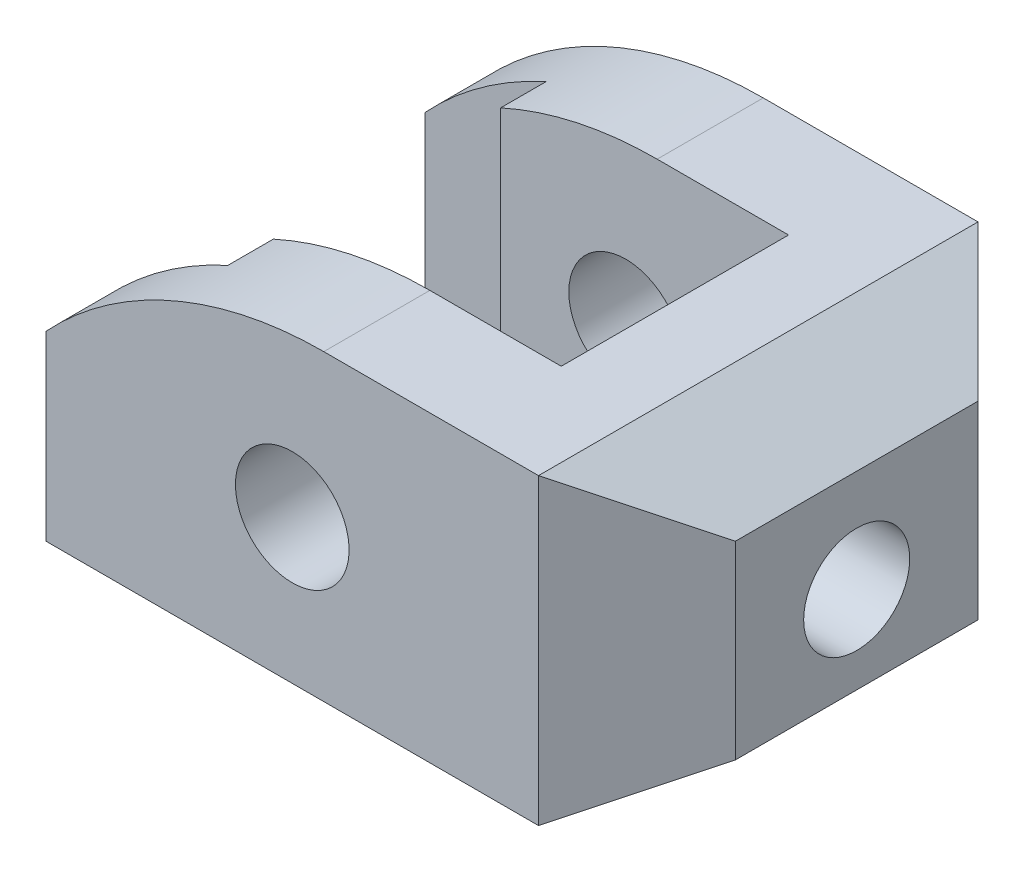
ISO-10303-21;
HEADER;
FILE_DESCRIPTION(('STEP AP214'),'2;1');
FILE_NAME('part.step','',(''),(''),'','','');
FILE_SCHEMA(('AUTOMOTIVE_DESIGN { 1 0 10303 214 1 1 1 1 }'));
ENDSEC;
DATA;
#1=APPLICATION_CONTEXT('core data for automotive mechanical design processes');
#2=APPLICATION_PROTOCOL_DEFINITION('international standard','automotive_design',2000,#1);
#3=PRODUCT_CONTEXT('',#1,'mechanical');
#4=PRODUCT('Part','Part','',(#3));
#5=PRODUCT_RELATED_PRODUCT_CATEGORY('part','',(#4));
#6=PRODUCT_DEFINITION_FORMATION('','',#4);
#7=PRODUCT_DEFINITION_CONTEXT('part definition',#1,'design');
#8=PRODUCT_DEFINITION('design','',#6,#7);
#9=PRODUCT_DEFINITION_SHAPE('','',#8);
#10=(LENGTH_UNIT() NAMED_UNIT(*) SI_UNIT(.MILLI.,.METRE.));
#11=(NAMED_UNIT(*) PLANE_ANGLE_UNIT() SI_UNIT($,.RADIAN.));
#12=(NAMED_UNIT(*) SI_UNIT($,.STERADIAN.) SOLID_ANGLE_UNIT());
#13=UNCERTAINTY_MEASURE_WITH_UNIT(LENGTH_MEASURE(1.E-05),#10,'distance_accuracy_value','');
#14=(GEOMETRIC_REPRESENTATION_CONTEXT(3) GLOBAL_UNCERTAINTY_ASSIGNED_CONTEXT((#13)) GLOBAL_UNIT_ASSIGNED_CONTEXT((#10,
#11,#12)) REPRESENTATION_CONTEXT('',''));
#15=CARTESIAN_POINT('',(0.,0.,0.));
#16=DIRECTION('',(0.,0.,1.));
#17=DIRECTION('',(1.,0.,0.));
#18=AXIS2_PLACEMENT_3D('',#15,#16,#17);
#19=CARTESIAN_POINT('',(4.16060555964673,-29.,58.));
#20=DIRECTION('',(0.,0.,-1.));
#21=DIRECTION('',(-1.,0.,0.));
#22=AXIS2_PLACEMENT_3D('',#19,#20,#21);
#23=CYLINDRICAL_SURFACE('',#22,50.);
#24=DIRECTION('',(0.,0.,-1.));
#25=VECTOR('',#24,1.);
#26=CARTESIAN_POINT('',(-16.5,16.5317403347236,58.));
#27=LINE('',#26,#25);
#28=CARTESIAN_POINT('',(-16.5,16.5317403347236,44.));
#29=VERTEX_POINT('',#28);
#30=CARTESIAN_POINT('',(-16.5,16.5317403347236,50.));
#31=VERTEX_POINT('',#30);
#32=EDGE_CURVE('E307',#29,#31,#27,.F.);
#33=ORIENTED_EDGE('',*,*,#32,.T.);
#34=CARTESIAN_POINT('',(4.16060555964673,-29.,50.));
#35=DIRECTION('',(0.,0.,1.));
#36=DIRECTION('',(1.,0.,0.));
#37=AXIS2_PLACEMENT_3D('',#34,#35,#36);
#38=CIRCLE('',#37,50.);
#39=CARTESIAN_POINT('',(-32.5,4.99999999999999,50.));
#40=VERTEX_POINT('',#39);
#41=EDGE_CURVE('E236',#31,#40,#38,.T.);
#42=ORIENTED_EDGE('',*,*,#41,.T.);
#43=DIRECTION('',(0.,0.,-1.));
#44=VECTOR('',#43,1.);
#45=CARTESIAN_POINT('',(-32.5,5.,58.));
#46=LINE('',#45,#44);
#47=CARTESIAN_POINT('',(-32.5,5.,58.));
#48=VERTEX_POINT('',#47);
#49=EDGE_CURVE('E265',#48,#40,#46,.T.);
#50=ORIENTED_EDGE('',*,*,#49,.F.);
#51=CARTESIAN_POINT('',(4.16060555964673,-29.,58.));
#52=DIRECTION('',(0.,0.,1.));
#53=DIRECTION('',(-1.,0.,0.));
#54=AXIS2_PLACEMENT_3D('',#51,#52,#53);
#55=CIRCLE('',#54,50.);
#56=CARTESIAN_POINT('',(4.16060555964673,21.,58.));
#57=VERTEX_POINT('',#56);
#58=EDGE_CURVE('E261',#57,#48,#55,.T.);
#59=ORIENTED_EDGE('',*,*,#58,.F.);
#60=DIRECTION('',(0.,0.,-1.));
#61=VECTOR('',#60,1.);
#62=CARTESIAN_POINT('',(4.16060555964673,21.,58.));
#63=LINE('',#62,#61);
#64=CARTESIAN_POINT('',(4.16060555964673,21.,44.));
#65=VERTEX_POINT('',#64);
#66=EDGE_CURVE('E231',#57,#65,#63,.T.);
#67=ORIENTED_EDGE('',*,*,#66,.T.);
#68=CARTESIAN_POINT('',(4.16060555964673,-29.,44.));
#69=DIRECTION('',(0.,0.,1.));
#70=DIRECTION('',(1.,0.,0.));
#71=AXIS2_PLACEMENT_3D('',#68,#69,#70);
#72=CIRCLE('',#71,50.);
#73=EDGE_CURVE('E235',#65,#29,#72,.T.);
#74=ORIENTED_EDGE('',*,*,#73,.T.);
#75=EDGE_LOOP('',(#33,#42,#50,#59,#67,#74));
#76=FACE_BOUND('',#75,.T.);
#77=ADVANCED_FACE('F45',(#76),#23,.T.);
#78=CARTESIAN_POINT('',(-32.5,-19.,58.));
#79=DIRECTION('',(1.,0.,0.));
#80=DIRECTION('',(0.,0.,-1.));
#81=AXIS2_PLACEMENT_3D('',#78,#79,#80);
#82=PLANE('',#81);
#83=ORIENTED_EDGE('',*,*,#49,.T.);
#84=DIRECTION('',(0.,1.,0.));
#85=VECTOR('',#84,1.);
#86=CARTESIAN_POINT('',(-32.5,-19.,50.));
#87=LINE('',#86,#85);
#88=CARTESIAN_POINT('',(-32.5,-19.,50.));
#89=VERTEX_POINT('',#88);
#90=EDGE_CURVE('E325',#89,#40,#87,.T.);
#91=ORIENTED_EDGE('',*,*,#90,.F.);
#92=DIRECTION('',(0.,0.,-1.));
#93=VECTOR('',#92,1.);
#94=CARTESIAN_POINT('',(-32.5,-19.,58.));
#95=LINE('',#94,#93);
#96=CARTESIAN_POINT('',(-32.5,-19.,58.));
#97=VERTEX_POINT('',#96);
#98=EDGE_CURVE('E202',#97,#89,#95,.T.);
#99=ORIENTED_EDGE('',*,*,#98,.F.);
#100=DIRECTION('',(0.,-1.,0.));
#101=VECTOR('',#100,1.);
#102=CARTESIAN_POINT('',(-32.5,-19.,58.));
#103=LINE('',#102,#101);
#104=EDGE_CURVE('E258',#48,#97,#103,.T.);
#105=ORIENTED_EDGE('',*,*,#104,.F.);
#106=EDGE_LOOP('',(#83,#91,#99,#105));
#107=FACE_BOUND('',#106,.T.);
#108=ADVANCED_FACE('F388',(#107),#82,.F.);
#109=CARTESIAN_POINT('',(0.,0.,58.));
#110=DIRECTION('',(0.,0.,-1.));
#111=DIRECTION('',(-1.,0.,0.));
#112=AXIS2_PLACEMENT_3D('',#109,#110,#111);
#113=CYLINDRICAL_SURFACE('',#112,7.5);
#114=CARTESIAN_POINT('',(0.,0.,14.));
#115=DIRECTION('',(0.,0.,-1.));
#116=DIRECTION('',(-1.,0.,0.));
#117=AXIS2_PLACEMENT_3D('',#114,#115,#116);
#118=CIRCLE('',#117,7.5);
#119=CARTESIAN_POINT('',(-7.5,0.,14.));
#120=VERTEX_POINT('',#119);
#121=EDGE_CURVE('E290',#120,#120,#118,.T.);
#122=CARTESIAN_POINT('',(0.,0.,0.));
#123=DIRECTION('',(0.,0.,1.));
#124=DIRECTION('',(1.,0.,0.));
#125=AXIS2_PLACEMENT_3D('',#122,#123,#124);
#126=CIRCLE('',#125,7.5);
#127=CARTESIAN_POINT('',(-7.5,0.,0.));
#128=VERTEX_POINT('',#127);
#129=EDGE_CURVE('E254',#128,#128,#126,.T.);
#130=CARTESIAN_POINT('',(-7.5,0.,14.));
#131=CARTESIAN_POINT('',(-7.5,0.,13.8541666666667));
#132=CARTESIAN_POINT('',(-7.5,0.,13.7083333333333));
#133=CARTESIAN_POINT('',(-7.5,0.,13.4166666666667));
#134=CARTESIAN_POINT('',(-7.5,0.,13.2708333333333));
#135=CARTESIAN_POINT('',(-7.5,0.,12.9791666666667));
#136=CARTESIAN_POINT('',(-7.5,0.,12.8333333333333));
#137=CARTESIAN_POINT('',(-7.5,0.,12.5416666666667));
#138=CARTESIAN_POINT('',(-7.5,0.,12.3958333333333));
#139=CARTESIAN_POINT('',(-7.5,0.,12.1041666666667));
#140=CARTESIAN_POINT('',(-7.5,0.,11.9583333333333));
#141=CARTESIAN_POINT('',(-7.5,0.,11.6666666666667));
#142=CARTESIAN_POINT('',(-7.5,0.,11.5208333333333));
#143=CARTESIAN_POINT('',(-7.5,0.,11.2291666666667));
#144=CARTESIAN_POINT('',(-7.5,0.,11.0833333333333));
#145=CARTESIAN_POINT('',(-7.5,0.,10.7916666666667));
#146=CARTESIAN_POINT('',(-7.5,0.,10.6458333333333));
#147=CARTESIAN_POINT('',(-7.5,0.,10.3541666666667));
#148=CARTESIAN_POINT('',(-7.5,0.,10.2083333333333));
#149=CARTESIAN_POINT('',(-7.5,0.,9.91666666666668));
#150=CARTESIAN_POINT('',(-7.5,0.,9.77083333333334));
#151=CARTESIAN_POINT('',(-7.5,0.,9.47916666666667));
#152=CARTESIAN_POINT('',(-7.5,0.,9.33333333333334));
#153=CARTESIAN_POINT('',(-7.5,0.,9.04166666666667));
#154=CARTESIAN_POINT('',(-7.5,0.,8.89583333333334));
#155=CARTESIAN_POINT('',(-7.5,0.,8.60416666666667));
#156=CARTESIAN_POINT('',(-7.5,0.,8.45833333333334));
#157=CARTESIAN_POINT('',(-7.5,0.,8.16666666666667));
#158=CARTESIAN_POINT('',(-7.5,0.,8.02083333333334));
#159=CARTESIAN_POINT('',(-7.5,0.,7.72916666666667));
#160=CARTESIAN_POINT('',(-7.5,0.,7.58333333333334));
#161=CARTESIAN_POINT('',(-7.5,0.,7.29166666666667));
#162=CARTESIAN_POINT('',(-7.5,0.,7.14583333333334));
#163=CARTESIAN_POINT('',(-7.5,0.,6.85416666666667));
#164=CARTESIAN_POINT('',(-7.5,0.,6.70833333333334));
#165=CARTESIAN_POINT('',(-7.5,0.,6.41666666666667));
#166=CARTESIAN_POINT('',(-7.5,0.,6.27083333333334));
#167=CARTESIAN_POINT('',(-7.5,0.,5.97916666666667));
#168=CARTESIAN_POINT('',(-7.5,0.,5.83333333333334));
#169=CARTESIAN_POINT('',(-7.5,0.,5.54166666666667));
#170=CARTESIAN_POINT('',(-7.5,0.,5.39583333333334));
#171=CARTESIAN_POINT('',(-7.5,0.,5.10416666666667));
#172=CARTESIAN_POINT('',(-7.5,0.,4.95833333333334));
#173=CARTESIAN_POINT('',(-7.5,0.,4.66666666666667));
#174=CARTESIAN_POINT('',(-7.5,0.,4.52083333333334));
#175=CARTESIAN_POINT('',(-7.5,0.,4.22916666666667));
#176=CARTESIAN_POINT('',(-7.5,0.,4.08333333333334));
#177=CARTESIAN_POINT('',(-7.5,0.,3.79166666666667));
#178=CARTESIAN_POINT('',(-7.5,0.,3.64583333333334));
#179=CARTESIAN_POINT('',(-7.5,0.,3.35416666666667));
#180=CARTESIAN_POINT('',(-7.5,0.,3.20833333333334));
#181=CARTESIAN_POINT('',(-7.5,0.,2.91666666666667));
#182=CARTESIAN_POINT('',(-7.5,0.,2.77083333333334));
#183=CARTESIAN_POINT('',(-7.5,0.,2.47916666666667));
#184=CARTESIAN_POINT('',(-7.5,0.,2.33333333333334));
#185=CARTESIAN_POINT('',(-7.5,0.,2.04166666666667));
#186=CARTESIAN_POINT('',(-7.5,0.,1.89583333333333));
#187=CARTESIAN_POINT('',(-7.5,0.,1.60416666666667));
#188=CARTESIAN_POINT('',(-7.5,0.,1.45833333333333));
#189=CARTESIAN_POINT('',(-7.5,0.,1.16666666666667));
#190=CARTESIAN_POINT('',(-7.5,0.,1.02083333333333));
#191=CARTESIAN_POINT('',(-7.5,0.,0.729166666666667));
#192=CARTESIAN_POINT('',(-7.5,0.,0.583333333333334));
#193=CARTESIAN_POINT('',(-7.5,0.,0.291666666666667));
#194=CARTESIAN_POINT('',(-7.5,0.,0.145833333333333));
#195=CARTESIAN_POINT('',(-7.5,0.,0.));
#196=B_SPLINE_CURVE_WITH_KNOTS('',3,(#130,#131,#132,#133,#134,#135,#136,#137,#138,#139,#140,
#141,#142,#143,#144,#145,#146,#147,#148,#149,#150,#151,#152,#153,#154,#155,#156,#157,#158,#159,
#160,#161,#162,#163,#164,#165,#166,#167,#168,#169,#170,#171,#172,#173,#174,#175,#176,#177,#178,
#179,#180,#181,#182,#183,#184,#185,#186,#187,#188,#189,#190,#191,#192,#193,#194,#195),
.UNSPECIFIED.,.F.,.F.,(4,2,2,2,2,2,2,2,2,2,2,2,2,2,2,2,2,2,2,2,2,2,2,2,2,2,2,2,2,2,2,2,4),(0.,
0.4375,0.875000000000001,1.3125,1.75,2.1875,2.625,3.0625,3.5,3.9375,4.375,4.8125,5.25,
5.68750000000001,6.12500000000001,6.56250000000001,7.00000000000001,7.43750000000001,
7.87500000000001,8.31250000000001,8.75000000000001,9.18750000000001,9.62500000000001,10.0625,
10.5,10.9375,11.375,11.8125,12.25,12.6875,13.125,13.5625,14.),.UNSPECIFIED.);
#197=EDGE_CURVE('BSEAM384',#120,#128,#196,.T.);
#198=ORIENTED_EDGE('',*,*,#121,.F.);
#199=ORIENTED_EDGE('',*,*,#129,.F.);
#200=ORIENTED_EDGE('',*,*,#197,.T.);
#201=ORIENTED_EDGE('',*,*,#197,.F.);
#202=EDGE_LOOP('',(#198,#200,#199,#201));
#203=FACE_BOUND('',#202,.T.);
#204=ADVANCED_FACE('F384',(#203),#113,.F.);
#205=CARTESIAN_POINT('',(4.16060555964673,-29.,58.));
#206=DIRECTION('',(0.,0.,-1.));
#207=DIRECTION('',(-1.,0.,0.));
#208=AXIS2_PLACEMENT_3D('',#205,#206,#207);
#209=PLANE('',#208);
#210=DIRECTION('',(1.,0.,0.));
#211=VECTOR('',#210,1.);
#212=CARTESIAN_POINT('',(32.5,-19.,58.));
#213=LINE('',#212,#211);
#214=CARTESIAN_POINT('',(32.5,-19.,58.));
#215=VERTEX_POINT('',#214);
#216=EDGE_CURVE('E255',#97,#215,#213,.T.);
#217=ORIENTED_EDGE('',*,*,#216,.T.);
#218=DIRECTION('',(0.,1.,0.));
#219=VECTOR('',#218,1.);
#220=CARTESIAN_POINT('',(32.5,-19.,58.));
#221=LINE('',#220,#219);
#222=CARTESIAN_POINT('',(32.5,21.,58.));
#223=VERTEX_POINT('',#222);
#224=EDGE_CURVE('E189',#215,#223,#221,.T.);
#225=ORIENTED_EDGE('',*,*,#224,.T.);
#226=DIRECTION('',(-1.,0.,0.));
#227=VECTOR('',#226,1.);
#228=CARTESIAN_POINT('',(32.5,21.,58.));
#229=LINE('',#228,#227);
#230=EDGE_CURVE('E251',#223,#57,#229,.T.);
#231=ORIENTED_EDGE('',*,*,#230,.T.);
#232=ORIENTED_EDGE('',*,*,#58,.T.);
#233=ORIENTED_EDGE('',*,*,#104,.T.);
#234=EDGE_LOOP('',(#217,#225,#231,#232,#233));
#235=FACE_BOUND('',#234,.T.);
#236=CARTESIAN_POINT('',(0.,0.,58.));
#237=DIRECTION('',(0.,0.,1.));
#238=DIRECTION('',(1.,0.,0.));
#239=AXIS2_PLACEMENT_3D('',#236,#237,#238);
#240=CIRCLE('',#239,7.5);
#241=CARTESIAN_POINT('',(-7.5,0.,58.));
#242=VERTEX_POINT('',#241);
#243=EDGE_CURVE('E239',#242,#242,#240,.T.);
#244=ORIENTED_EDGE('',*,*,#243,.F.);
#245=EDGE_LOOP('',(#244));
#246=FACE_BOUND('',#245,.T.);
#247=ADVANCED_FACE('F387',(#235,#246),#209,.F.);
#248=CARTESIAN_POINT('',(4.16060555964673,-29.,0.));
#249=DIRECTION('',(0.,0.,-1.));
#250=DIRECTION('',(-1.,0.,0.));
#251=AXIS2_PLACEMENT_3D('',#248,#249,#250);
#252=PLANE('',#251);
#253=DIRECTION('',(0.,1.,0.));
#254=VECTOR('',#253,1.);
#255=CARTESIAN_POINT('',(32.5,-19.,0.));
#256=LINE('',#255,#254);
#257=CARTESIAN_POINT('',(32.5,-19.,0.));
#258=VERTEX_POINT('',#257);
#259=CARTESIAN_POINT('',(32.5,21.,0.));
#260=VERTEX_POINT('',#259);
#261=EDGE_CURVE('E166',#258,#260,#256,.T.);
#262=ORIENTED_EDGE('',*,*,#261,.F.);
#263=DIRECTION('',(1.,0.,0.));
#264=VECTOR('',#263,1.);
#265=CARTESIAN_POINT('',(32.5,-19.,0.));
#266=LINE('',#265,#264);
#267=CARTESIAN_POINT('',(-32.5,-19.,0.));
#268=VERTEX_POINT('',#267);
#269=EDGE_CURVE('E184',#268,#258,#266,.T.);
#270=ORIENTED_EDGE('',*,*,#269,.F.);
#271=DIRECTION('',(0.,-1.,0.));
#272=VECTOR('',#271,1.);
#273=CARTESIAN_POINT('',(-32.5,-19.,0.));
#274=LINE('',#273,#272);
#275=CARTESIAN_POINT('',(-32.5,5.,0.));
#276=VERTEX_POINT('',#275);
#277=EDGE_CURVE('E241',#276,#268,#274,.T.);
#278=ORIENTED_EDGE('',*,*,#277,.F.);
#279=CARTESIAN_POINT('',(4.16060555964673,-29.,0.));
#280=DIRECTION('',(0.,0.,1.));
#281=DIRECTION('',(-1.,0.,0.));
#282=AXIS2_PLACEMENT_3D('',#279,#280,#281);
#283=CIRCLE('',#282,50.);
#284=CARTESIAN_POINT('',(4.16060555964673,21.,0.));
#285=VERTEX_POINT('',#284);
#286=EDGE_CURVE('E246',#285,#276,#283,.T.);
#287=ORIENTED_EDGE('',*,*,#286,.F.);
#288=DIRECTION('',(-1.,0.,0.));
#289=VECTOR('',#288,1.);
#290=CARTESIAN_POINT('',(32.5,21.,0.));
#291=LINE('',#290,#289);
#292=EDGE_CURVE('E187',#260,#285,#291,.T.);
#293=ORIENTED_EDGE('',*,*,#292,.F.);
#294=EDGE_LOOP('',(#262,#270,#278,#287,#293));
#295=FACE_BOUND('',#294,.T.);
#296=ORIENTED_EDGE('',*,*,#129,.T.);
#297=EDGE_LOOP('',(#296));
#298=FACE_BOUND('',#297,.T.);
#299=ADVANCED_FACE('F181',(#295,#298),#252,.T.);
#300=CARTESIAN_POINT('',(4.16060555964673,-29.,8.));
#301=DIRECTION('',(0.,0.,-1.));
#302=DIRECTION('',(-1.,0.,0.));
#303=AXIS2_PLACEMENT_3D('',#300,#301,#302);
#304=CIRCLE('',#303,50.);
#305=CARTESIAN_POINT('',(-32.5,4.99999999999999,8.));
#306=VERTEX_POINT('',#305);
#307=CARTESIAN_POINT('',(-16.5,16.5317403347236,8.));
#308=VERTEX_POINT('',#307);
#309=EDGE_CURVE('E99',#306,#308,#304,.T.);
#310=ORIENTED_EDGE('',*,*,#309,.T.);
#311=DIRECTION('',(0.,0.,-1.));
#312=VECTOR('',#311,1.);
#313=CARTESIAN_POINT('',(-16.5,16.5317403347236,58.));
#314=LINE('',#313,#312);
#315=CARTESIAN_POINT('',(-16.5,16.5317403347236,14.));
#316=VERTEX_POINT('',#315);
#317=EDGE_CURVE('E70',#308,#316,#314,.F.);
#318=ORIENTED_EDGE('',*,*,#317,.T.);
#319=CARTESIAN_POINT('',(4.16060555964673,-29.,14.));
#320=DIRECTION('',(0.,0.,-1.));
#321=DIRECTION('',(-1.,0.,0.));
#322=AXIS2_PLACEMENT_3D('',#319,#320,#321);
#323=CIRCLE('',#322,50.);
#324=CARTESIAN_POINT('',(4.16060555964673,21.,14.));
#325=VERTEX_POINT('',#324);
#326=EDGE_CURVE('E273',#316,#325,#323,.T.);
#327=ORIENTED_EDGE('',*,*,#326,.T.);
#328=EDGE_CURVE('E237',#325,#285,#63,.T.);
#329=ORIENTED_EDGE('',*,*,#328,.T.);
#330=ORIENTED_EDGE('',*,*,#286,.T.);
#331=EDGE_CURVE('E245',#306,#276,#46,.T.);
#332=ORIENTED_EDGE('',*,*,#331,.F.);
#333=EDGE_LOOP('',(#310,#318,#327,#329,#330,#332));
#334=FACE_BOUND('',#333,.T.);
#335=ADVANCED_FACE('F47',(#334),#23,.T.);
#336=CARTESIAN_POINT('',(-32.5,-19.,8.));
#337=VERTEX_POINT('',#336);
#338=EDGE_CURVE('E199',#337,#268,#95,.T.);
#339=ORIENTED_EDGE('',*,*,#338,.F.);
#340=DIRECTION('',(0.,1.,0.));
#341=VECTOR('',#340,1.);
#342=CARTESIAN_POINT('',(-32.5,-19.,8.));
#343=LINE('',#342,#341);
#344=EDGE_CURVE('E250',#337,#306,#343,.T.);
#345=ORIENTED_EDGE('',*,*,#344,.T.);
#346=ORIENTED_EDGE('',*,*,#331,.T.);
#347=ORIENTED_EDGE('',*,*,#277,.T.);
#348=EDGE_LOOP('',(#339,#345,#346,#347));
#349=FACE_BOUND('',#348,.T.);
#350=ADVANCED_FACE('F399',(#349),#82,.F.);
#351=CARTESIAN_POINT('',(32.5,-19.,58.));
#352=DIRECTION('',(0.,1.,0.));
#353=DIRECTION('',(-1.,0.,0.));
#354=AXIS2_PLACEMENT_3D('',#351,#352,#353);
#355=PLANE('',#354);
#356=DIRECTION('',(-1.,0.,0.));
#357=VECTOR('',#356,1.);
#358=CARTESIAN_POINT('',(21.5,-19.,14.));
#359=LINE('',#358,#357);
#360=CARTESIAN_POINT('',(21.5,-19.,14.));
#361=VERTEX_POINT('',#360);
#362=CARTESIAN_POINT('',(-16.5,-19.,14.));
#363=VERTEX_POINT('',#362);
#364=EDGE_CURVE('E244',#361,#363,#359,.T.);
#365=ORIENTED_EDGE('',*,*,#364,.T.);
#366=DIRECTION('',(0.,0.,-1.));
#367=VECTOR('',#366,1.);
#368=CARTESIAN_POINT('',(-16.5,-19.,14.));
#369=LINE('',#368,#367);
#370=CARTESIAN_POINT('',(-16.5,-19.,8.));
#371=VERTEX_POINT('',#370);
#372=EDGE_CURVE('E296',#363,#371,#369,.T.);
#373=ORIENTED_EDGE('',*,*,#372,.T.);
#374=DIRECTION('',(-1.,0.,0.));
#375=VECTOR('',#374,1.);
#376=CARTESIAN_POINT('',(-16.5,-19.,8.));
#377=LINE('',#376,#375);
#378=EDGE_CURVE('E335',#371,#337,#377,.T.);
#379=ORIENTED_EDGE('',*,*,#378,.T.);
#380=ORIENTED_EDGE('',*,*,#338,.T.);
#381=ORIENTED_EDGE('',*,*,#269,.T.);
#382=DIRECTION('',(0.,0.,-1.));
#383=VECTOR('',#382,1.);
#384=CARTESIAN_POINT('',(32.5,-19.,58.));
#385=LINE('',#384,#383);
#386=EDGE_CURVE('E196',#215,#258,#385,.T.);
#387=ORIENTED_EDGE('',*,*,#386,.F.);
#388=ORIENTED_EDGE('',*,*,#216,.F.);
#389=ORIENTED_EDGE('',*,*,#98,.T.);
#390=DIRECTION('',(1.,0.,0.));
#391=VECTOR('',#390,1.);
#392=CARTESIAN_POINT('',(-16.5,-19.,50.));
#393=LINE('',#392,#391);
#394=CARTESIAN_POINT('',(-16.5,-19.,50.));
#395=VERTEX_POINT('',#394);
#396=EDGE_CURVE('E317',#89,#395,#393,.T.);
#397=ORIENTED_EDGE('',*,*,#396,.T.);
#398=DIRECTION('',(0.,0.,-1.));
#399=VECTOR('',#398,1.);
#400=CARTESIAN_POINT('',(-16.5,-19.,44.));
#401=LINE('',#400,#399);
#402=CARTESIAN_POINT('',(-16.5,-19.,44.));
#403=VERTEX_POINT('',#402);
#404=EDGE_CURVE('E301',#395,#403,#401,.T.);
#405=ORIENTED_EDGE('',*,*,#404,.T.);
#406=DIRECTION('',(1.,0.,0.));
#407=VECTOR('',#406,1.);
#408=CARTESIAN_POINT('',(21.5,-19.,44.));
#409=LINE('',#408,#407);
#410=CARTESIAN_POINT('',(21.5,-19.,44.));
#411=VERTEX_POINT('',#410);
#412=EDGE_CURVE('E216',#403,#411,#409,.T.);
#413=ORIENTED_EDGE('',*,*,#412,.T.);
#414=DIRECTION('',(0.,0.,-1.));
#415=VECTOR('',#414,1.);
#416=CARTESIAN_POINT('',(21.5,-19.,44.));
#417=LINE('',#416,#415);
#418=EDGE_CURVE('E209',#411,#361,#417,.T.);
#419=ORIENTED_EDGE('',*,*,#418,.T.);
#420=EDGE_LOOP('',(#365,#373,#379,#380,#381,#387,#388,#389,#397,#405,#413,#419));
#421=FACE_BOUND('',#420,.T.);
#422=ADVANCED_FACE('F194',(#421),#355,.F.);
#423=CARTESIAN_POINT('',(32.5,-19.,58.));
#424=DIRECTION('',(-0.500000000000001,0.866025403784438,0.));
#425=DIRECTION('',(-0.866025403784438,-0.500000000000001,0.));
#426=AXIS2_PLACEMENT_3D('',#423,#424,#425);
#427=PLANE('',#426);
#428=ORIENTED_EDGE('',*,*,#386,.T.);
#429=DIRECTION('',(0.654653670707976,0.377964473009228,0.654653670707978));
#430=VECTOR('',#429,1.);
#431=CARTESIAN_POINT('',(57.3571428571428,-4.64872188014355,24.857142857143));
#432=LINE('',#431,#430);
#433=CARTESIAN_POINT('',(45.4903810567666,-11.5,12.9903810567667));
#434=VERTEX_POINT('',#433);
#435=EDGE_CURVE('E163',#258,#434,#432,.T.);
#436=ORIENTED_EDGE('',*,*,#435,.T.);
#437=DIRECTION('',(0.,0.,-1.));
#438=VECTOR('',#437,1.);
#439=CARTESIAN_POINT('',(45.4903810567666,-11.5,58.));
#440=LINE('',#439,#438);
#441=CARTESIAN_POINT('',(45.4903810567666,-11.5,45.0096189432334));
#442=VERTEX_POINT('',#441);
#443=EDGE_CURVE('E208',#442,#434,#440,.T.);
#444=ORIENTED_EDGE('',*,*,#443,.F.);
#445=DIRECTION('',(-0.654653670707976,-0.377964473009228,0.654653670707978));
#446=VECTOR('',#445,1.);
#447=CARTESIAN_POINT('',(32.5,-19.,58.));
#448=LINE('',#447,#446);
#449=EDGE_CURVE('E175',#442,#215,#448,.T.);
#450=ORIENTED_EDGE('',*,*,#449,.T.);
#451=EDGE_LOOP('',(#428,#436,#444,#450));
#452=FACE_BOUND('',#451,.T.);
#453=ADVANCED_FACE('F205',(#452),#427,.F.);
#454=CARTESIAN_POINT('',(45.4903810567666,-11.5,58.));
#455=DIRECTION('',(-1.,0.,0.));
#456=DIRECTION('',(0.,0.,1.));
#457=AXIS2_PLACEMENT_3D('',#454,#455,#456);
#458=PLANE('',#457);
#459=CARTESIAN_POINT('',(45.4903810567666,0.,29.));
#460=DIRECTION('',(-1.,0.,0.));
#461=DIRECTION('',(0.,0.,1.));
#462=AXIS2_PLACEMENT_3D('',#459,#460,#461);
#463=CIRCLE('',#462,7.);
#464=CARTESIAN_POINT('',(45.4903810567666,0.,36.));
#465=VERTEX_POINT('',#464);
#466=EDGE_CURVE('E313',#465,#465,#463,.T.);
#467=ORIENTED_EDGE('',*,*,#466,.T.);
#468=EDGE_LOOP('',(#467));
#469=FACE_BOUND('',#468,.T.);
#470=ORIENTED_EDGE('',*,*,#443,.T.);
#471=DIRECTION('',(0.,1.,0.));
#472=VECTOR('',#471,1.);
#473=CARTESIAN_POINT('',(45.4903810567666,-19.,12.9903810567667));
#474=LINE('',#473,#472);
#475=CARTESIAN_POINT('',(45.4903810567666,13.5000000000001,12.9903810567667));
#476=VERTEX_POINT('',#475);
#477=EDGE_CURVE('E168',#434,#476,#474,.T.);
#478=ORIENTED_EDGE('',*,*,#477,.T.);
#479=DIRECTION('',(0.,0.,-1.));
#480=VECTOR('',#479,1.);
#481=CARTESIAN_POINT('',(45.4903810567666,13.5000000000001,58.));
#482=LINE('',#481,#480);
#483=CARTESIAN_POINT('',(45.4903810567666,13.5000000000001,45.0096189432334));
#484=VERTEX_POINT('',#483);
#485=EDGE_CURVE('E213',#484,#476,#482,.T.);
#486=ORIENTED_EDGE('',*,*,#485,.F.);
#487=DIRECTION('',(0.,1.,0.));
#488=VECTOR('',#487,1.);
#489=CARTESIAN_POINT('',(45.4903810567666,-19.,45.0096189432334));
#490=LINE('',#489,#488);
#491=EDGE_CURVE('E61',#442,#484,#490,.T.);
#492=ORIENTED_EDGE('',*,*,#491,.F.);
#493=EDGE_LOOP('',(#470,#478,#486,#492));
#494=FACE_BOUND('',#493,.T.);
#495=ADVANCED_FACE('F362',(#469,#494),#458,.F.);
#496=CARTESIAN_POINT('',(45.4903810567666,13.5000000000001,58.));
#497=DIRECTION('',(-0.499999999999995,-0.866025403784442,0.));
#498=DIRECTION('',(0.866025403784442,-0.499999999999995,0.));
#499=AXIS2_PLACEMENT_3D('',#496,#497,#498);
#500=PLANE('',#499);
#501=ORIENTED_EDGE('',*,*,#485,.T.);
#502=DIRECTION('',(-0.654653670707978,0.377964473009222,-0.65465367070798));
#503=VECTOR('',#502,1.);
#504=CARTESIAN_POINT('',(64.7802177467238,2.36300759442952,32.280217746724));
#505=LINE('',#504,#503);
#506=EDGE_CURVE('E11',#476,#260,#505,.T.);
#507=ORIENTED_EDGE('',*,*,#506,.T.);
#508=DIRECTION('',(0.,0.,-1.));
#509=VECTOR('',#508,1.);
#510=CARTESIAN_POINT('',(32.5,21.,58.));
#511=LINE('',#510,#509);
#512=EDGE_CURVE('E226',#223,#260,#511,.T.);
#513=ORIENTED_EDGE('',*,*,#512,.F.);
#514=DIRECTION('',(0.654653670707978,-0.377964473009222,-0.65465367070798));
#515=VECTOR('',#514,1.);
#516=CARTESIAN_POINT('',(39.9230748895808,16.7142857142858,50.5769251104191));
#517=LINE('',#516,#515);
#518=EDGE_CURVE('E54',#223,#484,#517,.T.);
#519=ORIENTED_EDGE('',*,*,#518,.T.);
#520=EDGE_LOOP('',(#501,#507,#513,#519));
#521=FACE_BOUND('',#520,.T.);
#522=ADVANCED_FACE('F358',(#521),#500,.F.);
#523=CARTESIAN_POINT('',(32.5,21.,58.));
#524=DIRECTION('',(0.,-1.,0.));
#525=DIRECTION('',(1.,0.,0.));
#526=AXIS2_PLACEMENT_3D('',#523,#524,#525);
#527=PLANE('',#526);
#528=ORIENTED_EDGE('',*,*,#328,.F.);
#529=DIRECTION('',(1.,0.,0.));
#530=VECTOR('',#529,1.);
#531=CARTESIAN_POINT('',(32.4999999999999,21.,14.));
#532=LINE('',#531,#530);
#533=CARTESIAN_POINT('',(21.5,21.,14.));
#534=VERTEX_POINT('',#533);
#535=EDGE_CURVE('E225',#325,#534,#532,.T.);
#536=ORIENTED_EDGE('',*,*,#535,.T.);
#537=DIRECTION('',(0.,0.,1.));
#538=VECTOR('',#537,1.);
#539=CARTESIAN_POINT('',(21.5,21.,58.));
#540=LINE('',#539,#538);
#541=CARTESIAN_POINT('',(21.5,21.,44.));
#542=VERTEX_POINT('',#541);
#543=EDGE_CURVE('E280',#534,#542,#540,.T.);
#544=ORIENTED_EDGE('',*,*,#543,.T.);
#545=DIRECTION('',(-1.,0.,0.));
#546=VECTOR('',#545,1.);
#547=CARTESIAN_POINT('',(32.5,21.,44.));
#548=LINE('',#547,#546);
#549=EDGE_CURVE('E230',#542,#65,#548,.T.);
#550=ORIENTED_EDGE('',*,*,#549,.T.);
#551=ORIENTED_EDGE('',*,*,#66,.F.);
#552=ORIENTED_EDGE('',*,*,#230,.F.);
#553=ORIENTED_EDGE('',*,*,#512,.T.);
#554=ORIENTED_EDGE('',*,*,#292,.T.);
#555=EDGE_LOOP('',(#528,#536,#544,#550,#551,#552,#553,#554));
#556=FACE_BOUND('',#555,.T.);
#557=ADVANCED_FACE('F427',(#556),#527,.F.);
#558=CARTESIAN_POINT('',(0.,0.,44.));
#559=DIRECTION('',(0.,0.,1.));
#560=DIRECTION('',(1.,0.,0.));
#561=AXIS2_PLACEMENT_3D('',#558,#559,#560);
#562=CIRCLE('',#561,7.5);
#563=CARTESIAN_POINT('',(-7.5,0.,44.));
#564=VERTEX_POINT('',#563);
#565=EDGE_CURVE('E219',#564,#564,#562,.T.);
#566=CARTESIAN_POINT('',(-7.5,0.,44.));
#567=CARTESIAN_POINT('',(-7.5,0.,44.1458333333333));
#568=CARTESIAN_POINT('',(-7.5,0.,44.2916666666667));
#569=CARTESIAN_POINT('',(-7.5,0.,44.5833333333333));
#570=CARTESIAN_POINT('',(-7.5,0.,44.7291666666667));
#571=CARTESIAN_POINT('',(-7.5,0.,45.0208333333333));
#572=CARTESIAN_POINT('',(-7.5,0.,45.1666666666667));
#573=CARTESIAN_POINT('',(-7.5,0.,45.4583333333333));
#574=CARTESIAN_POINT('',(-7.5,0.,45.6041666666667));
#575=CARTESIAN_POINT('',(-7.5,0.,45.8958333333333));
#576=CARTESIAN_POINT('',(-7.5,0.,46.0416666666667));
#577=CARTESIAN_POINT('',(-7.5,0.,46.3333333333333));
#578=CARTESIAN_POINT('',(-7.5,0.,46.4791666666667));
#579=CARTESIAN_POINT('',(-7.5,0.,46.7708333333333));
#580=CARTESIAN_POINT('',(-7.5,0.,46.9166666666667));
#581=CARTESIAN_POINT('',(-7.5,0.,47.2083333333333));
#582=CARTESIAN_POINT('',(-7.5,0.,47.3541666666667));
#583=CARTESIAN_POINT('',(-7.5,0.,47.6458333333333));
#584=CARTESIAN_POINT('',(-7.5,0.,47.7916666666667));
#585=CARTESIAN_POINT('',(-7.5,0.,48.0833333333333));
#586=CARTESIAN_POINT('',(-7.5,0.,48.2291666666667));
#587=CARTESIAN_POINT('',(-7.5,0.,48.5208333333333));
#588=CARTESIAN_POINT('',(-7.5,0.,48.6666666666667));
#589=CARTESIAN_POINT('',(-7.5,0.,48.9583333333333));
#590=CARTESIAN_POINT('',(-7.5,0.,49.1041666666667));
#591=CARTESIAN_POINT('',(-7.5,0.,49.3958333333333));
#592=CARTESIAN_POINT('',(-7.5,0.,49.5416666666667));
#593=CARTESIAN_POINT('',(-7.5,0.,49.8333333333333));
#594=CARTESIAN_POINT('',(-7.5,0.,49.9791666666667));
#595=CARTESIAN_POINT('',(-7.5,0.,50.2708333333333));
#596=CARTESIAN_POINT('',(-7.5,0.,50.4166666666667));
#597=CARTESIAN_POINT('',(-7.5,0.,50.7083333333333));
#598=CARTESIAN_POINT('',(-7.5,0.,50.8541666666667));
#599=CARTESIAN_POINT('',(-7.5,0.,51.1458333333333));
#600=CARTESIAN_POINT('',(-7.5,0.,51.2916666666667));
#601=CARTESIAN_POINT('',(-7.5,0.,51.5833333333333));
#602=CARTESIAN_POINT('',(-7.5,0.,51.7291666666667));
#603=CARTESIAN_POINT('',(-7.5,0.,52.0208333333333));
#604=CARTESIAN_POINT('',(-7.5,0.,52.1666666666667));
#605=CARTESIAN_POINT('',(-7.5,0.,52.4583333333333));
#606=CARTESIAN_POINT('',(-7.5,0.,52.6041666666667));
#607=CARTESIAN_POINT('',(-7.5,0.,52.8958333333333));
#608=CARTESIAN_POINT('',(-7.5,0.,53.0416666666667));
#609=CARTESIAN_POINT('',(-7.5,0.,53.3333333333333));
#610=CARTESIAN_POINT('',(-7.5,0.,53.4791666666667));
#611=CARTESIAN_POINT('',(-7.5,0.,53.7708333333333));
#612=CARTESIAN_POINT('',(-7.5,0.,53.9166666666667));
#613=CARTESIAN_POINT('',(-7.5,0.,54.2083333333333));
#614=CARTESIAN_POINT('',(-7.5,0.,54.3541666666667));
#615=CARTESIAN_POINT('',(-7.5,0.,54.6458333333333));
#616=CARTESIAN_POINT('',(-7.5,0.,54.7916666666667));
#617=CARTESIAN_POINT('',(-7.5,0.,55.0833333333333));
#618=CARTESIAN_POINT('',(-7.5,0.,55.2291666666667));
#619=CARTESIAN_POINT('',(-7.5,0.,55.5208333333333));
#620=CARTESIAN_POINT('',(-7.5,0.,55.6666666666667));
#621=CARTESIAN_POINT('',(-7.5,0.,55.9583333333333));
#622=CARTESIAN_POINT('',(-7.5,0.,56.1041666666667));
#623=CARTESIAN_POINT('',(-7.5,0.,56.3958333333333));
#624=CARTESIAN_POINT('',(-7.5,0.,56.5416666666667));
#625=CARTESIAN_POINT('',(-7.5,0.,56.8333333333333));
#626=CARTESIAN_POINT('',(-7.5,0.,56.9791666666667));
#627=CARTESIAN_POINT('',(-7.5,0.,57.2708333333333));
#628=CARTESIAN_POINT('',(-7.5,0.,57.4166666666667));
#629=CARTESIAN_POINT('',(-7.5,0.,57.7083333333333));
#630=CARTESIAN_POINT('',(-7.5,0.,57.8541666666667));
#631=CARTESIAN_POINT('',(-7.5,0.,58.));
#632=B_SPLINE_CURVE_WITH_KNOTS('',3,(#566,#567,#568,#569,#570,#571,#572,#573,#574,#575,#576,
#577,#578,#579,#580,#581,#582,#583,#584,#585,#586,#587,#588,#589,#590,#591,#592,#593,#594,#595,
#596,#597,#598,#599,#600,#601,#602,#603,#604,#605,#606,#607,#608,#609,#610,#611,#612,#613,#614,
#615,#616,#617,#618,#619,#620,#621,#622,#623,#624,#625,#626,#627,#628,#629,#630,#631),
.UNSPECIFIED.,.F.,.F.,(4,2,2,2,2,2,2,2,2,2,2,2,2,2,2,2,2,2,2,2,2,2,2,2,2,2,2,2,2,2,2,2,4),(0.,
0.4375,0.874999999999994,1.31249999999999,1.74999999999999,2.1875,2.625,3.0625,3.5,3.9375,4.375,
4.81249999999999,5.24999999999999,5.68749999999999,6.12499999999999,6.56249999999999,
6.99999999999999,7.43749999999999,7.87499999999999,8.31249999999999,8.74999999999999,
9.18749999999999,9.62499999999999,10.0625,10.5,10.9375,11.375,11.8125,12.25,12.6875,13.125,
13.5625,14.),.UNSPECIFIED.);
#633=EDGE_CURVE('BSEAM390',#564,#242,#632,.T.);
#634=ORIENTED_EDGE('',*,*,#565,.F.);
#635=ORIENTED_EDGE('',*,*,#243,.T.);
#636=ORIENTED_EDGE('',*,*,#633,.T.);
#637=ORIENTED_EDGE('',*,*,#633,.F.);
#638=EDGE_LOOP('',(#634,#636,#635,#637));
#639=FACE_BOUND('',#638,.T.);
#640=ADVANCED_FACE('F390',(#639),#113,.F.);
#641=CARTESIAN_POINT('',(21.5,-19.,44.));
#642=DIRECTION('',(1.,0.,0.));
#643=DIRECTION('',(0.,1.,0.));
#644=AXIS2_PLACEMENT_3D('',#641,#642,#643);
#645=PLANE('',#644);
#646=CARTESIAN_POINT('',(21.5,0.,29.));
#647=DIRECTION('',(1.,0.,0.));
#648=DIRECTION('',(0.,1.,0.));
#649=AXIS2_PLACEMENT_3D('',#646,#647,#648);
#650=CIRCLE('',#649,7.);
#651=CARTESIAN_POINT('',(21.5,7.,29.));
#652=VERTEX_POINT('',#651);
#653=EDGE_CURVE('E174',#652,#652,#650,.T.);
#654=ORIENTED_EDGE('',*,*,#653,.T.);
#655=EDGE_LOOP('',(#654));
#656=FACE_BOUND('',#655,.T.);
#657=DIRECTION('',(0.,1.,0.));
#658=VECTOR('',#657,1.);
#659=CARTESIAN_POINT('',(21.5,-19.,14.));
#660=LINE('',#659,#658);
#661=EDGE_CURVE('E291',#361,#534,#660,.T.);
#662=ORIENTED_EDGE('',*,*,#661,.F.);
#663=ORIENTED_EDGE('',*,*,#418,.F.);
#664=DIRECTION('',(0.,1.,0.));
#665=VECTOR('',#664,1.);
#666=CARTESIAN_POINT('',(21.5,-19.,44.));
#667=LINE('',#666,#665);
#668=EDGE_CURVE('E272',#411,#542,#667,.T.);
#669=ORIENTED_EDGE('',*,*,#668,.T.);
#670=ORIENTED_EDGE('',*,*,#543,.F.);
#671=EDGE_LOOP('',(#662,#663,#669,#670));
#672=FACE_BOUND('',#671,.T.);
#673=ADVANCED_FACE('F429',(#656,#672),#645,.F.);
#674=CARTESIAN_POINT('',(21.5,-19.,14.));
#675=DIRECTION('',(0.,0.,-1.));
#676=DIRECTION('',(-1.,0.,0.));
#677=AXIS2_PLACEMENT_3D('',#674,#675,#676);
#678=PLANE('',#677);
#679=ORIENTED_EDGE('',*,*,#121,.T.);
#680=EDGE_LOOP('',(#679));
#681=FACE_BOUND('',#680,.T.);
#682=DIRECTION('',(0.,1.,0.));
#683=VECTOR('',#682,1.);
#684=CARTESIAN_POINT('',(-16.5,-19.,14.));
#685=LINE('',#684,#683);
#686=EDGE_CURVE('E332',#363,#316,#685,.T.);
#687=ORIENTED_EDGE('',*,*,#686,.F.);
#688=ORIENTED_EDGE('',*,*,#364,.F.);
#689=ORIENTED_EDGE('',*,*,#661,.T.);
#690=ORIENTED_EDGE('',*,*,#535,.F.);
#691=ORIENTED_EDGE('',*,*,#326,.F.);
#692=EDGE_LOOP('',(#687,#688,#689,#690,#691));
#693=FACE_BOUND('',#692,.T.);
#694=ADVANCED_FACE('F381',(#681,#693),#678,.F.);
#695=CARTESIAN_POINT('',(21.5,-19.,44.));
#696=DIRECTION('',(0.,0.,1.));
#697=DIRECTION('',(1.,0.,0.));
#698=AXIS2_PLACEMENT_3D('',#695,#696,#697);
#699=PLANE('',#698);
#700=ORIENTED_EDGE('',*,*,#565,.T.);
#701=EDGE_LOOP('',(#700));
#702=FACE_BOUND('',#701,.T.);
#703=ORIENTED_EDGE('',*,*,#549,.F.);
#704=ORIENTED_EDGE('',*,*,#668,.F.);
#705=ORIENTED_EDGE('',*,*,#412,.F.);
#706=DIRECTION('',(0.,1.,0.));
#707=VECTOR('',#706,1.);
#708=CARTESIAN_POINT('',(-16.5,-19.,44.));
#709=LINE('',#708,#707);
#710=EDGE_CURVE('E326',#403,#29,#709,.T.);
#711=ORIENTED_EDGE('',*,*,#710,.T.);
#712=ORIENTED_EDGE('',*,*,#73,.F.);
#713=EDGE_LOOP('',(#703,#704,#705,#711,#712));
#714=FACE_BOUND('',#713,.T.);
#715=ADVANCED_FACE('F416',(#702,#714),#699,.F.);
#716=CARTESIAN_POINT('',(-16.5,-19.,44.));
#717=DIRECTION('',(1.,0.,0.));
#718=DIRECTION('',(0.,1.,0.));
#719=AXIS2_PLACEMENT_3D('',#716,#717,#718);
#720=PLANE('',#719);
#721=ORIENTED_EDGE('',*,*,#710,.F.);
#722=ORIENTED_EDGE('',*,*,#404,.F.);
#723=DIRECTION('',(0.,1.,0.));
#724=VECTOR('',#723,1.);
#725=CARTESIAN_POINT('',(-16.5,-19.,50.));
#726=LINE('',#725,#724);
#727=EDGE_CURVE('E321',#395,#31,#726,.T.);
#728=ORIENTED_EDGE('',*,*,#727,.T.);
#729=ORIENTED_EDGE('',*,*,#32,.F.);
#730=EDGE_LOOP('',(#721,#722,#728,#729));
#731=FACE_BOUND('',#730,.T.);
#732=ADVANCED_FACE('F412',(#731),#720,.F.);
#733=CARTESIAN_POINT('',(-16.5,-19.,50.));
#734=DIRECTION('',(0.,0.,1.));
#735=DIRECTION('',(1.,0.,0.));
#736=AXIS2_PLACEMENT_3D('',#733,#734,#735);
#737=PLANE('',#736);
#738=ORIENTED_EDGE('',*,*,#727,.F.);
#739=ORIENTED_EDGE('',*,*,#396,.F.);
#740=ORIENTED_EDGE('',*,*,#90,.T.);
#741=ORIENTED_EDGE('',*,*,#41,.F.);
#742=EDGE_LOOP('',(#738,#739,#740,#741));
#743=FACE_BOUND('',#742,.T.);
#744=ADVANCED_FACE('F421',(#743),#737,.F.);
#745=CARTESIAN_POINT('',(-16.5,-19.,8.));
#746=DIRECTION('',(0.,0.,-1.));
#747=DIRECTION('',(-1.,0.,0.));
#748=AXIS2_PLACEMENT_3D('',#745,#746,#747);
#749=PLANE('',#748);
#750=ORIENTED_EDGE('',*,*,#344,.F.);
#751=ORIENTED_EDGE('',*,*,#378,.F.);
#752=DIRECTION('',(0.,1.,0.));
#753=VECTOR('',#752,1.);
#754=CARTESIAN_POINT('',(-16.5,-19.,8.));
#755=LINE('',#754,#753);
#756=EDGE_CURVE('E93',#371,#308,#755,.T.);
#757=ORIENTED_EDGE('',*,*,#756,.T.);
#758=ORIENTED_EDGE('',*,*,#309,.F.);
#759=EDGE_LOOP('',(#750,#751,#757,#758));
#760=FACE_BOUND('',#759,.T.);
#761=ADVANCED_FACE('F436',(#760),#749,.F.);
#762=CARTESIAN_POINT('',(-16.5,-19.,14.));
#763=DIRECTION('',(1.,0.,0.));
#764=DIRECTION('',(0.,1.,0.));
#765=AXIS2_PLACEMENT_3D('',#762,#763,#764);
#766=PLANE('',#765);
#767=ORIENTED_EDGE('',*,*,#756,.F.);
#768=ORIENTED_EDGE('',*,*,#372,.F.);
#769=ORIENTED_EDGE('',*,*,#686,.T.);
#770=ORIENTED_EDGE('',*,*,#317,.F.);
#771=EDGE_LOOP('',(#767,#768,#769,#770));
#772=FACE_BOUND('',#771,.T.);
#773=ADVANCED_FACE('F433',(#772),#766,.F.);
#774=CARTESIAN_POINT('',(-32.5,0.,29.));
#775=DIRECTION('',(1.,0.,0.));
#776=DIRECTION('',(0.,0.,-1.));
#777=AXIS2_PLACEMENT_3D('',#774,#775,#776);
#778=CYLINDRICAL_SURFACE('',#777,7.);
#779=ORIENTED_EDGE('',*,*,#653,.F.);
#780=EDGE_LOOP('',(#779));
#781=FACE_BOUND('',#780,.T.);
#782=ORIENTED_EDGE('',*,*,#466,.F.);
#783=EDGE_LOOP('',(#782));
#784=FACE_BOUND('',#783,.T.);
#785=ADVANCED_FACE('F435',(#781,#784),#778,.F.);
#786=CARTESIAN_POINT('',(32.5,-19.,58.));
#787=DIRECTION('',(-0.707106781186549,0.,-0.707106781186546));
#788=DIRECTION('',(-0.707106781186546,0.,0.707106781186549));
#789=AXIS2_PLACEMENT_3D('',#786,#787,#788);
#790=PLANE('',#789);
#791=ORIENTED_EDGE('',*,*,#491,.T.);
#792=ORIENTED_EDGE('',*,*,#518,.F.);
#793=ORIENTED_EDGE('',*,*,#224,.F.);
#794=ORIENTED_EDGE('',*,*,#449,.F.);
#795=EDGE_LOOP('',(#791,#792,#793,#794));
#796=FACE_BOUND('',#795,.T.);
#797=ADVANCED_FACE('F443',(#796),#790,.F.);
#798=CARTESIAN_POINT('',(32.5,-19.,0.));
#799=DIRECTION('',(-0.707106781186549,0.,0.707106781186546));
#800=DIRECTION('',(0.707106781186546,0.,0.707106781186549));
#801=AXIS2_PLACEMENT_3D('',#798,#799,#800);
#802=PLANE('',#801);
#803=ORIENTED_EDGE('',*,*,#261,.T.);
#804=ORIENTED_EDGE('',*,*,#506,.F.);
#805=ORIENTED_EDGE('',*,*,#477,.F.);
#806=ORIENTED_EDGE('',*,*,#435,.F.);
#807=EDGE_LOOP('',(#803,#804,#805,#806));
#808=FACE_BOUND('',#807,.T.);
#809=ADVANCED_FACE('F165',(#808),#802,.F.);
#810=CLOSED_SHELL('',(#77,#108,#204,#247,#299,#335,#350,#422,#453,#495,#522,#557,#640,#673,#694,
#715,#732,#744,#761,#773,#785,#797,#809));
#811=MANIFOLD_SOLID_BREP('B2',#810);
#812=ADVANCED_BREP_SHAPE_REPRESENTATION('',(#18,#811),#14);
#813=SHAPE_DEFINITION_REPRESENTATION(#9,#812);
ENDSEC;
END-ISO-10303-21;
